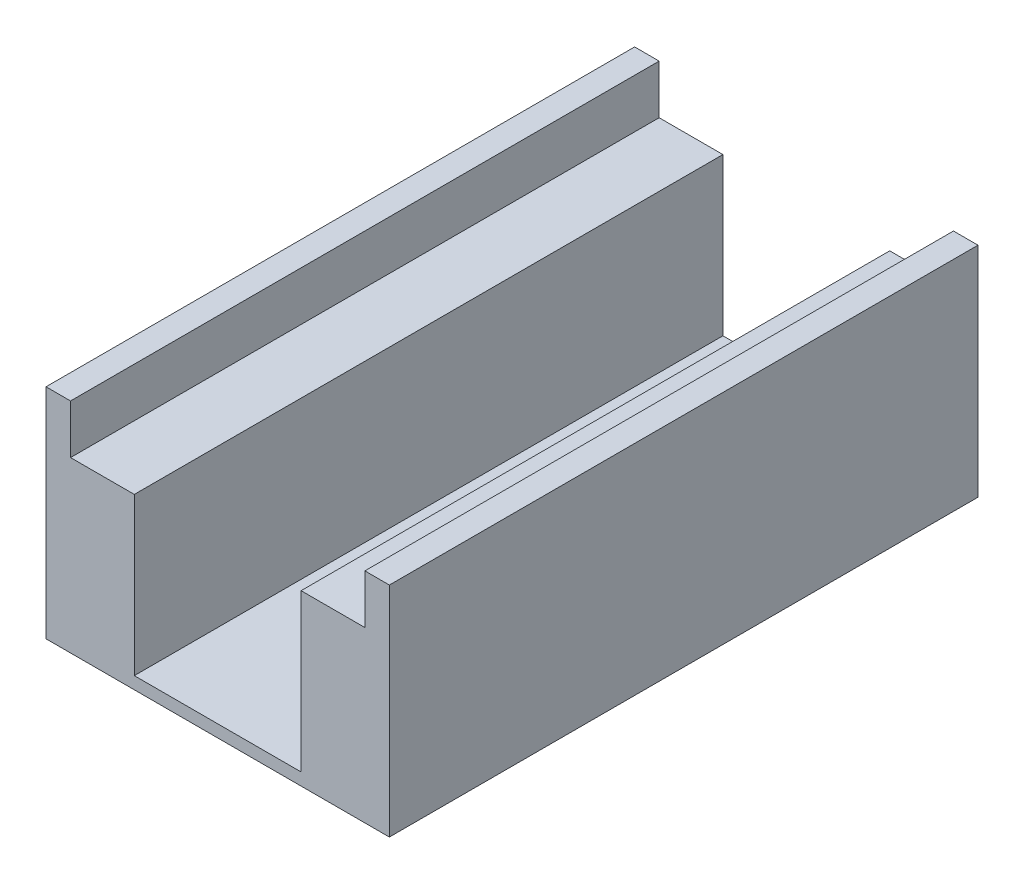
ISO-10303-21;
HEADER;
FILE_DESCRIPTION(('STEP AP214'),'2;1');
FILE_NAME('part.step','',(''),(''),'','','');
FILE_SCHEMA(('AUTOMOTIVE_DESIGN { 1 0 10303 214 1 1 1 1 }'));
ENDSEC;
DATA;
#1=APPLICATION_CONTEXT('core data for automotive mechanical design processes');
#2=APPLICATION_PROTOCOL_DEFINITION('international standard','automotive_design',2000,#1);
#3=PRODUCT_CONTEXT('',#1,'mechanical');
#4=PRODUCT('Part','Part','',(#3));
#5=PRODUCT_RELATED_PRODUCT_CATEGORY('part','',(#4));
#6=PRODUCT_DEFINITION_FORMATION('','',#4);
#7=PRODUCT_DEFINITION_CONTEXT('part definition',#1,'design');
#8=PRODUCT_DEFINITION('design','',#6,#7);
#9=PRODUCT_DEFINITION_SHAPE('','',#8);
#10=(LENGTH_UNIT() NAMED_UNIT(*) SI_UNIT(.MILLI.,.METRE.));
#11=(NAMED_UNIT(*) PLANE_ANGLE_UNIT() SI_UNIT($,.RADIAN.));
#12=(NAMED_UNIT(*) SI_UNIT($,.STERADIAN.) SOLID_ANGLE_UNIT());
#13=UNCERTAINTY_MEASURE_WITH_UNIT(LENGTH_MEASURE(1.E-05),#10,'distance_accuracy_value','');
#14=(GEOMETRIC_REPRESENTATION_CONTEXT(3) GLOBAL_UNCERTAINTY_ASSIGNED_CONTEXT((#13)) GLOBAL_UNIT_ASSIGNED_CONTEXT((#10,
#11,#12)) REPRESENTATION_CONTEXT('',''));
#15=CARTESIAN_POINT('',(0.,0.,0.));
#16=DIRECTION('',(0.,0.,1.));
#17=DIRECTION('',(1.,0.,0.));
#18=AXIS2_PLACEMENT_3D('',#15,#16,#17);
#19=CARTESIAN_POINT('',(0.,43.815,0.));
#20=DIRECTION('',(0.,-1.,0.));
#21=DIRECTION('',(0.,0.,-1.));
#22=AXIS2_PLACEMENT_3D('',#19,#20,#21);
#23=PLANE('',#22);
#24=DIRECTION('',(0.,0.,1.));
#25=VECTOR('',#24,1.);
#26=CARTESIAN_POINT('',(38.1,43.815,-76.2));
#27=LINE('',#26,#25);
#28=CARTESIAN_POINT('',(38.1,43.815,-76.2));
#29=VERTEX_POINT('',#28);
#30=CARTESIAN_POINT('',(38.1,43.815,76.2));
#31=VERTEX_POINT('',#30);
#32=EDGE_CURVE('E58',#29,#31,#27,.T.);
#33=ORIENTED_EDGE('',*,*,#32,.F.);
#34=DIRECTION('',(-1.,0.,0.));
#35=VECTOR('',#34,1.);
#36=CARTESIAN_POINT('',(44.45,43.815,-76.2));
#37=LINE('',#36,#35);
#38=CARTESIAN_POINT('',(21.59,43.815,-76.2));
#39=VERTEX_POINT('',#38);
#40=EDGE_CURVE('E205',#29,#39,#37,.T.);
#41=ORIENTED_EDGE('',*,*,#40,.T.);
#42=DIRECTION('',(0.,0.,1.));
#43=VECTOR('',#42,1.);
#44=CARTESIAN_POINT('',(21.59,43.815,-76.2));
#45=LINE('',#44,#43);
#46=CARTESIAN_POINT('',(21.59,43.815,76.2));
#47=VERTEX_POINT('',#46);
#48=EDGE_CURVE('E207',#39,#47,#45,.T.);
#49=ORIENTED_EDGE('',*,*,#48,.T.);
#50=DIRECTION('',(1.,0.,0.));
#51=VECTOR('',#50,1.);
#52=CARTESIAN_POINT('',(44.45,43.815,76.2));
#53=LINE('',#52,#51);
#54=EDGE_CURVE('E54',#47,#31,#53,.T.);
#55=ORIENTED_EDGE('',*,*,#54,.T.);
#56=EDGE_LOOP('',(#33,#41,#49,#55));
#57=FACE_BOUND('',#56,.T.);
#58=ADVANCED_FACE('F39',(#57),#23,.F.);
#59=CARTESIAN_POINT('',(0.,43.815,0.));
#60=DIRECTION('',(0.,1.,0.));
#61=DIRECTION('',(0.,0.,1.));
#62=AXIS2_PLACEMENT_3D('',#59,#60,#61);
#63=PLANE('',#62);
#64=DIRECTION('',(-1.,0.,0.));
#65=VECTOR('',#64,1.);
#66=CARTESIAN_POINT('',(-44.45,43.815,-76.2));
#67=LINE('',#66,#65);
#68=CARTESIAN_POINT('',(-21.59,43.815,-76.2));
#69=VERTEX_POINT('',#68);
#70=CARTESIAN_POINT('',(-38.1,43.815,-76.2));
#71=VERTEX_POINT('',#70);
#72=EDGE_CURVE('E186',#69,#71,#67,.T.);
#73=ORIENTED_EDGE('',*,*,#72,.T.);
#74=DIRECTION('',(0.,0.,-1.));
#75=VECTOR('',#74,1.);
#76=CARTESIAN_POINT('',(-38.1,43.815,-76.2));
#77=LINE('',#76,#75);
#78=CARTESIAN_POINT('',(-38.1,43.815,76.2));
#79=VERTEX_POINT('',#78);
#80=EDGE_CURVE('E152',#79,#71,#77,.T.);
#81=ORIENTED_EDGE('',*,*,#80,.F.);
#82=DIRECTION('',(1.,0.,0.));
#83=VECTOR('',#82,1.);
#84=CARTESIAN_POINT('',(-44.45,43.815,76.2));
#85=LINE('',#84,#83);
#86=CARTESIAN_POINT('',(-21.59,43.815,76.2));
#87=VERTEX_POINT('',#86);
#88=EDGE_CURVE('E181',#79,#87,#85,.T.);
#89=ORIENTED_EDGE('',*,*,#88,.T.);
#90=DIRECTION('',(0.,0.,-1.));
#91=VECTOR('',#90,1.);
#92=CARTESIAN_POINT('',(-21.59,43.815,-76.2));
#93=LINE('',#92,#91);
#94=EDGE_CURVE('E183',#87,#69,#93,.T.);
#95=ORIENTED_EDGE('',*,*,#94,.T.);
#96=EDGE_LOOP('',(#73,#81,#89,#95));
#97=FACE_BOUND('',#96,.T.);
#98=ADVANCED_FACE('F253',(#97),#63,.T.);
#99=CARTESIAN_POINT('',(44.45,3.175,-76.2));
#100=DIRECTION('',(-1.,0.,0.));
#101=DIRECTION('',(0.,0.,1.));
#102=AXIS2_PLACEMENT_3D('',#99,#100,#101);
#103=PLANE('',#102);
#104=DIRECTION('',(0.,0.,-1.));
#105=VECTOR('',#104,1.);
#106=CARTESIAN_POINT('',(44.45,0.,-76.2));
#107=LINE('',#106,#105);
#108=CARTESIAN_POINT('',(44.45,0.,76.2));
#109=VERTEX_POINT('',#108);
#110=CARTESIAN_POINT('',(44.45,0.,-76.2));
#111=VERTEX_POINT('',#110);
#112=EDGE_CURVE('E197',#109,#111,#107,.T.);
#113=ORIENTED_EDGE('',*,*,#112,.T.);
#114=DIRECTION('',(0.,-1.,0.));
#115=VECTOR('',#114,1.);
#116=CARTESIAN_POINT('',(44.45,3.175,-76.2));
#117=LINE('',#116,#115);
#118=CARTESIAN_POINT('',(44.45,56.515,-76.2));
#119=VERTEX_POINT('',#118);
#120=EDGE_CURVE('E11',#119,#111,#117,.T.);
#121=ORIENTED_EDGE('',*,*,#120,.F.);
#122=DIRECTION('',(0.,0.,-1.));
#123=VECTOR('',#122,1.);
#124=CARTESIAN_POINT('',(44.45,56.515,-76.2));
#125=LINE('',#124,#123);
#126=CARTESIAN_POINT('',(44.45,56.515,76.2));
#127=VERTEX_POINT('',#126);
#128=EDGE_CURVE('E172',#127,#119,#125,.T.);
#129=ORIENTED_EDGE('',*,*,#128,.F.);
#130=DIRECTION('',(0.,-1.,0.));
#131=VECTOR('',#130,1.);
#132=CARTESIAN_POINT('',(44.45,3.175,76.2));
#133=LINE('',#132,#131);
#134=EDGE_CURVE('E136',#127,#109,#133,.T.);
#135=ORIENTED_EDGE('',*,*,#134,.T.);
#136=EDGE_LOOP('',(#113,#121,#129,#135));
#137=FACE_BOUND('',#136,.T.);
#138=ADVANCED_FACE('F41',(#137),#103,.F.);
#139=CARTESIAN_POINT('',(-44.45,3.175,-76.2));
#140=DIRECTION('',(0.,0.,1.));
#141=DIRECTION('',(1.,0.,0.));
#142=AXIS2_PLACEMENT_3D('',#139,#140,#141);
#143=PLANE('',#142);
#144=DIRECTION('',(-1.,0.,0.));
#145=VECTOR('',#144,1.);
#146=CARTESIAN_POINT('',(-44.45,0.,-76.2));
#147=LINE('',#146,#145);
#148=CARTESIAN_POINT('',(-44.45,0.,-76.2));
#149=VERTEX_POINT('',#148);
#150=EDGE_CURVE('E217',#111,#149,#147,.T.);
#151=ORIENTED_EDGE('',*,*,#150,.T.);
#152=DIRECTION('',(0.,-1.,0.));
#153=VECTOR('',#152,1.);
#154=CARTESIAN_POINT('',(-44.45,3.175,-76.2));
#155=LINE('',#154,#153);
#156=CARTESIAN_POINT('',(-44.45,56.515,-76.2));
#157=VERTEX_POINT('',#156);
#158=EDGE_CURVE('E47',#157,#149,#155,.T.);
#159=ORIENTED_EDGE('',*,*,#158,.F.);
#160=DIRECTION('',(-1.,0.,0.));
#161=VECTOR('',#160,1.);
#162=CARTESIAN_POINT('',(-44.45,56.515,-76.2));
#163=LINE('',#162,#161);
#164=CARTESIAN_POINT('',(-38.1,56.515,-76.2));
#165=VERTEX_POINT('',#164);
#166=EDGE_CURVE('E151',#165,#157,#163,.T.);
#167=ORIENTED_EDGE('',*,*,#166,.F.);
#168=DIRECTION('',(0.,-1.,0.));
#169=VECTOR('',#168,1.);
#170=CARTESIAN_POINT('',(-38.1,56.515,-76.2));
#171=LINE('',#170,#169);
#172=EDGE_CURVE('E158',#165,#71,#171,.T.);
#173=ORIENTED_EDGE('',*,*,#172,.T.);
#174=ORIENTED_EDGE('',*,*,#72,.F.);
#175=DIRECTION('',(0.,-1.,0.));
#176=VECTOR('',#175,1.);
#177=CARTESIAN_POINT('',(-21.59,43.815,-76.2));
#178=LINE('',#177,#176);
#179=CARTESIAN_POINT('',(-21.59,3.175,-76.2));
#180=VERTEX_POINT('',#179);
#181=EDGE_CURVE('E188',#69,#180,#178,.T.);
#182=ORIENTED_EDGE('',*,*,#181,.T.);
#183=DIRECTION('',(-1.,0.,0.));
#184=VECTOR('',#183,1.);
#185=CARTESIAN_POINT('',(-44.45,3.175,-76.2));
#186=LINE('',#185,#184);
#187=CARTESIAN_POINT('',(21.59,3.175,-76.2));
#188=VERTEX_POINT('',#187);
#189=EDGE_CURVE('E210',#188,#180,#186,.T.);
#190=ORIENTED_EDGE('',*,*,#189,.F.);
#191=DIRECTION('',(0.,-1.,0.));
#192=VECTOR('',#191,1.);
#193=CARTESIAN_POINT('',(21.59,43.815,-76.2));
#194=LINE('',#193,#192);
#195=EDGE_CURVE('E163',#39,#188,#194,.T.);
#196=ORIENTED_EDGE('',*,*,#195,.F.);
#197=ORIENTED_EDGE('',*,*,#40,.F.);
#198=DIRECTION('',(0.,-1.,0.));
#199=VECTOR('',#198,1.);
#200=CARTESIAN_POINT('',(38.1,56.515,-76.2));
#201=LINE('',#200,#199);
#202=CARTESIAN_POINT('',(38.1,56.515,-76.2));
#203=VERTEX_POINT('',#202);
#204=EDGE_CURVE('E164',#203,#29,#201,.T.);
#205=ORIENTED_EDGE('',*,*,#204,.F.);
#206=DIRECTION('',(-1.,0.,0.));
#207=VECTOR('',#206,1.);
#208=CARTESIAN_POINT('',(44.45,56.515,-76.2));
#209=LINE('',#208,#207);
#210=EDGE_CURVE('E177',#119,#203,#209,.T.);
#211=ORIENTED_EDGE('',*,*,#210,.F.);
#212=ORIENTED_EDGE('',*,*,#120,.T.);
#213=EDGE_LOOP('',(#151,#159,#167,#173,#174,#182,#190,#196,#197,#205,#211,#212));
#214=FACE_BOUND('',#213,.T.);
#215=ADVANCED_FACE('F237',(#214),#143,.F.);
#216=CARTESIAN_POINT('',(-44.45,3.175,-76.2));
#217=DIRECTION('',(1.,0.,0.));
#218=DIRECTION('',(0.,0.,-1.));
#219=AXIS2_PLACEMENT_3D('',#216,#217,#218);
#220=PLANE('',#219);
#221=DIRECTION('',(0.,0.,1.));
#222=VECTOR('',#221,1.);
#223=CARTESIAN_POINT('',(-44.45,0.,-76.2));
#224=LINE('',#223,#222);
#225=CARTESIAN_POINT('',(-44.45,0.,76.2));
#226=VERTEX_POINT('',#225);
#227=EDGE_CURVE('E133',#149,#226,#224,.T.);
#228=ORIENTED_EDGE('',*,*,#227,.T.);
#229=DIRECTION('',(0.,-1.,0.));
#230=VECTOR('',#229,1.);
#231=CARTESIAN_POINT('',(-44.45,3.175,76.2));
#232=LINE('',#231,#230);
#233=CARTESIAN_POINT('',(-44.45,56.515,76.2));
#234=VERTEX_POINT('',#233);
#235=EDGE_CURVE('E126',#234,#226,#232,.T.);
#236=ORIENTED_EDGE('',*,*,#235,.F.);
#237=DIRECTION('',(0.,0.,1.));
#238=VECTOR('',#237,1.);
#239=CARTESIAN_POINT('',(-44.45,56.515,-76.2));
#240=LINE('',#239,#238);
#241=EDGE_CURVE('E131',#157,#234,#240,.T.);
#242=ORIENTED_EDGE('',*,*,#241,.F.);
#243=ORIENTED_EDGE('',*,*,#158,.T.);
#244=EDGE_LOOP('',(#228,#236,#242,#243));
#245=FACE_BOUND('',#244,.T.);
#246=ADVANCED_FACE('F128',(#245),#220,.F.);
#247=CARTESIAN_POINT('',(-44.45,3.175,76.2));
#248=DIRECTION('',(0.,0.,-1.));
#249=DIRECTION('',(-1.,0.,0.));
#250=AXIS2_PLACEMENT_3D('',#247,#248,#249);
#251=PLANE('',#250);
#252=DIRECTION('',(1.,0.,0.));
#253=VECTOR('',#252,1.);
#254=CARTESIAN_POINT('',(-44.45,0.,76.2));
#255=LINE('',#254,#253);
#256=EDGE_CURVE('E213',#226,#109,#255,.T.);
#257=ORIENTED_EDGE('',*,*,#256,.T.);
#258=ORIENTED_EDGE('',*,*,#134,.F.);
#259=DIRECTION('',(1.,0.,0.));
#260=VECTOR('',#259,1.);
#261=CARTESIAN_POINT('',(44.45,56.515,76.2));
#262=LINE('',#261,#260);
#263=CARTESIAN_POINT('',(38.1,56.515,76.2));
#264=VERTEX_POINT('',#263);
#265=EDGE_CURVE('E170',#264,#127,#262,.T.);
#266=ORIENTED_EDGE('',*,*,#265,.F.);
#267=DIRECTION('',(0.,-1.,0.));
#268=VECTOR('',#267,1.);
#269=CARTESIAN_POINT('',(38.1,56.515,76.2));
#270=LINE('',#269,#268);
#271=EDGE_CURVE('E167',#264,#31,#270,.T.);
#272=ORIENTED_EDGE('',*,*,#271,.T.);
#273=ORIENTED_EDGE('',*,*,#54,.F.);
#274=DIRECTION('',(0.,-1.,0.));
#275=VECTOR('',#274,1.);
#276=CARTESIAN_POINT('',(21.59,43.815,76.2));
#277=LINE('',#276,#275);
#278=CARTESIAN_POINT('',(21.59,3.175,76.2));
#279=VERTEX_POINT('',#278);
#280=EDGE_CURVE('E200',#47,#279,#277,.T.);
#281=ORIENTED_EDGE('',*,*,#280,.T.);
#282=DIRECTION('',(1.,0.,0.));
#283=VECTOR('',#282,1.);
#284=CARTESIAN_POINT('',(-44.45,3.175,76.2));
#285=LINE('',#284,#283);
#286=CARTESIAN_POINT('',(-21.59,3.175,76.2));
#287=VERTEX_POINT('',#286);
#288=EDGE_CURVE('E212',#287,#279,#285,.T.);
#289=ORIENTED_EDGE('',*,*,#288,.F.);
#290=DIRECTION('',(0.,-1.,0.));
#291=VECTOR('',#290,1.);
#292=CARTESIAN_POINT('',(-21.59,43.815,76.2));
#293=LINE('',#292,#291);
#294=EDGE_CURVE('E194',#87,#287,#293,.T.);
#295=ORIENTED_EDGE('',*,*,#294,.F.);
#296=ORIENTED_EDGE('',*,*,#88,.F.);
#297=DIRECTION('',(0.,-1.,0.));
#298=VECTOR('',#297,1.);
#299=CARTESIAN_POINT('',(-38.1,56.515,76.2));
#300=LINE('',#299,#298);
#301=CARTESIAN_POINT('',(-38.1,56.515,76.2));
#302=VERTEX_POINT('',#301);
#303=EDGE_CURVE('E143',#302,#79,#300,.T.);
#304=ORIENTED_EDGE('',*,*,#303,.F.);
#305=DIRECTION('',(1.,0.,0.));
#306=VECTOR('',#305,1.);
#307=CARTESIAN_POINT('',(-44.45,56.515,76.2));
#308=LINE('',#307,#306);
#309=EDGE_CURVE('E139',#234,#302,#308,.T.);
#310=ORIENTED_EDGE('',*,*,#309,.F.);
#311=ORIENTED_EDGE('',*,*,#235,.T.);
#312=EDGE_LOOP('',(#257,#258,#266,#272,#273,#281,#289,#295,#296,#304,#310,#311));
#313=FACE_BOUND('',#312,.T.);
#314=ADVANCED_FACE('F140',(#313),#251,.F.);
#315=CARTESIAN_POINT('',(0.,3.175,0.));
#316=DIRECTION('',(0.,1.,0.));
#317=DIRECTION('',(0.,0.,1.));
#318=AXIS2_PLACEMENT_3D('',#315,#316,#317);
#319=PLANE('',#318);
#320=DIRECTION('',(0.,0.,-1.));
#321=VECTOR('',#320,1.);
#322=CARTESIAN_POINT('',(-21.59,3.175,-76.2));
#323=LINE('',#322,#321);
#324=EDGE_CURVE('E184',#287,#180,#323,.T.);
#325=ORIENTED_EDGE('',*,*,#324,.F.);
#326=ORIENTED_EDGE('',*,*,#288,.T.);
#327=DIRECTION('',(0.,0.,1.));
#328=VECTOR('',#327,1.);
#329=CARTESIAN_POINT('',(21.59,3.175,-76.2));
#330=LINE('',#329,#328);
#331=EDGE_CURVE('E191',#188,#279,#330,.T.);
#332=ORIENTED_EDGE('',*,*,#331,.F.);
#333=ORIENTED_EDGE('',*,*,#189,.T.);
#334=EDGE_LOOP('',(#325,#326,#332,#333));
#335=FACE_BOUND('',#334,.T.);
#336=ADVANCED_FACE('F257',(#335),#319,.T.);
#337=CARTESIAN_POINT('',(0.,0.,0.));
#338=DIRECTION('',(0.,1.,0.));
#339=DIRECTION('',(0.,0.,1.));
#340=AXIS2_PLACEMENT_3D('',#337,#338,#339);
#341=PLANE('',#340);
#342=ORIENTED_EDGE('',*,*,#112,.F.);
#343=ORIENTED_EDGE('',*,*,#256,.F.);
#344=ORIENTED_EDGE('',*,*,#227,.F.);
#345=ORIENTED_EDGE('',*,*,#150,.F.);
#346=EDGE_LOOP('',(#342,#343,#344,#345));
#347=FACE_BOUND('',#346,.T.);
#348=ADVANCED_FACE('F225',(#347),#341,.F.);
#349=CARTESIAN_POINT('',(21.59,43.815,-76.2));
#350=DIRECTION('',(1.,0.,0.));
#351=DIRECTION('',(0.,0.,-1.));
#352=AXIS2_PLACEMENT_3D('',#349,#350,#351);
#353=PLANE('',#352);
#354=ORIENTED_EDGE('',*,*,#331,.T.);
#355=ORIENTED_EDGE('',*,*,#280,.F.);
#356=ORIENTED_EDGE('',*,*,#48,.F.);
#357=ORIENTED_EDGE('',*,*,#195,.T.);
#358=EDGE_LOOP('',(#354,#355,#356,#357));
#359=FACE_BOUND('',#358,.T.);
#360=ADVANCED_FACE('F243',(#359),#353,.F.);
#361=CARTESIAN_POINT('',(-21.59,43.815,-76.2));
#362=DIRECTION('',(-1.,0.,0.));
#363=DIRECTION('',(0.,0.,1.));
#364=AXIS2_PLACEMENT_3D('',#361,#362,#363);
#365=PLANE('',#364);
#366=ORIENTED_EDGE('',*,*,#324,.T.);
#367=ORIENTED_EDGE('',*,*,#181,.F.);
#368=ORIENTED_EDGE('',*,*,#94,.F.);
#369=ORIENTED_EDGE('',*,*,#294,.T.);
#370=EDGE_LOOP('',(#366,#367,#368,#369));
#371=FACE_BOUND('',#370,.T.);
#372=ADVANCED_FACE('F249',(#371),#365,.F.);
#373=CARTESIAN_POINT('',(-38.1,56.515,-76.2));
#374=DIRECTION('',(-1.,0.,0.));
#375=DIRECTION('',(0.,0.,1.));
#376=AXIS2_PLACEMENT_3D('',#373,#374,#375);
#377=PLANE('',#376);
#378=ORIENTED_EDGE('',*,*,#80,.T.);
#379=ORIENTED_EDGE('',*,*,#172,.F.);
#380=DIRECTION('',(0.,0.,-1.));
#381=VECTOR('',#380,1.);
#382=CARTESIAN_POINT('',(-38.1,56.515,-76.2));
#383=LINE('',#382,#381);
#384=EDGE_CURVE('E146',#302,#165,#383,.T.);
#385=ORIENTED_EDGE('',*,*,#384,.F.);
#386=ORIENTED_EDGE('',*,*,#303,.T.);
#387=EDGE_LOOP('',(#378,#379,#385,#386));
#388=FACE_BOUND('',#387,.T.);
#389=ADVANCED_FACE('F255',(#388),#377,.F.);
#390=CARTESIAN_POINT('',(0.,56.515,0.));
#391=DIRECTION('',(0.,1.,0.));
#392=DIRECTION('',(0.,0.,1.));
#393=AXIS2_PLACEMENT_3D('',#390,#391,#392);
#394=PLANE('',#393);
#395=ORIENTED_EDGE('',*,*,#241,.T.);
#396=ORIENTED_EDGE('',*,*,#309,.T.);
#397=ORIENTED_EDGE('',*,*,#384,.T.);
#398=ORIENTED_EDGE('',*,*,#166,.T.);
#399=EDGE_LOOP('',(#395,#396,#397,#398));
#400=FACE_BOUND('',#399,.T.);
#401=ADVANCED_FACE('F149',(#400),#394,.T.);
#402=CARTESIAN_POINT('',(38.1,56.515,-76.2));
#403=DIRECTION('',(1.,0.,0.));
#404=DIRECTION('',(0.,0.,-1.));
#405=AXIS2_PLACEMENT_3D('',#402,#403,#404);
#406=PLANE('',#405);
#407=ORIENTED_EDGE('',*,*,#32,.T.);
#408=ORIENTED_EDGE('',*,*,#271,.F.);
#409=DIRECTION('',(0.,0.,1.));
#410=VECTOR('',#409,1.);
#411=CARTESIAN_POINT('',(38.1,56.515,-76.2));
#412=LINE('',#411,#410);
#413=EDGE_CURVE('E175',#203,#264,#412,.T.);
#414=ORIENTED_EDGE('',*,*,#413,.F.);
#415=ORIENTED_EDGE('',*,*,#204,.T.);
#416=EDGE_LOOP('',(#407,#408,#414,#415));
#417=FACE_BOUND('',#416,.T.);
#418=ADVANCED_FACE('F236',(#417),#406,.F.);
#419=CARTESIAN_POINT('',(0.,56.515,0.));
#420=DIRECTION('',(0.,-1.,0.));
#421=DIRECTION('',(0.,0.,-1.));
#422=AXIS2_PLACEMENT_3D('',#419,#420,#421);
#423=PLANE('',#422);
#424=ORIENTED_EDGE('',*,*,#128,.T.);
#425=ORIENTED_EDGE('',*,*,#210,.T.);
#426=ORIENTED_EDGE('',*,*,#413,.T.);
#427=ORIENTED_EDGE('',*,*,#265,.T.);
#428=EDGE_LOOP('',(#424,#425,#426,#427));
#429=FACE_BOUND('',#428,.T.);
#430=ADVANCED_FACE('F231',(#429),#423,.F.);
#431=CLOSED_SHELL('',(#58,#98,#138,#215,#246,#314,#336,#348,#360,#372,#389,#401,#418,#430));
#432=MANIFOLD_SOLID_BREP('B2',#431);
#433=ADVANCED_BREP_SHAPE_REPRESENTATION('',(#18,#432),#14);
#434=SHAPE_DEFINITION_REPRESENTATION(#9,#433);
ENDSEC;
END-ISO-10303-21;
